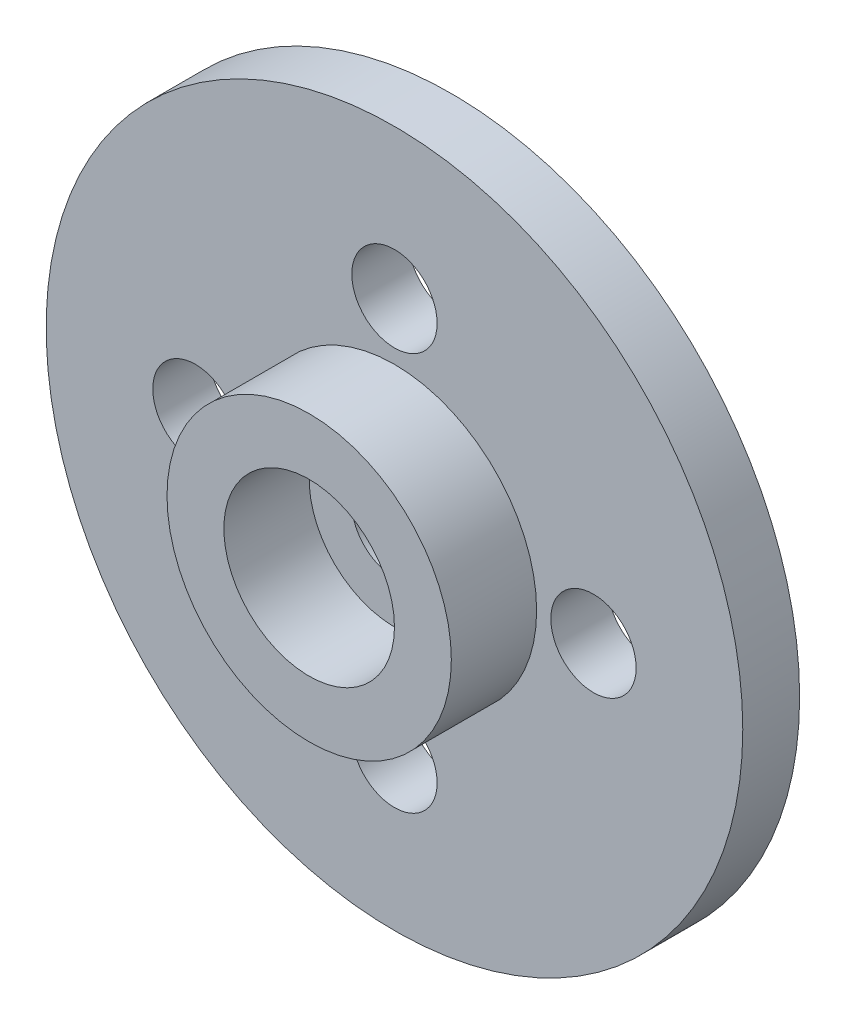
ISO-10303-21;
HEADER;
FILE_DESCRIPTION(('STEP AP214'),'2;1');
FILE_NAME('part.step','',(''),(''),'','','');
FILE_SCHEMA(('AUTOMOTIVE_DESIGN { 1 0 10303 214 1 1 1 1 }'));
ENDSEC;
DATA;
#1=APPLICATION_CONTEXT('core data for automotive mechanical design processes');
#2=APPLICATION_PROTOCOL_DEFINITION('international standard','automotive_design',2000,#1);
#3=PRODUCT_CONTEXT('',#1,'mechanical');
#4=PRODUCT('Part','Part','',(#3));
#5=PRODUCT_RELATED_PRODUCT_CATEGORY('part','',(#4));
#6=PRODUCT_DEFINITION_FORMATION('','',#4);
#7=PRODUCT_DEFINITION_CONTEXT('part definition',#1,'design');
#8=PRODUCT_DEFINITION('design','',#6,#7);
#9=PRODUCT_DEFINITION_SHAPE('','',#8);
#10=(LENGTH_UNIT() NAMED_UNIT(*) SI_UNIT(.MILLI.,.METRE.));
#11=(NAMED_UNIT(*) PLANE_ANGLE_UNIT() SI_UNIT($,.RADIAN.));
#12=(NAMED_UNIT(*) SI_UNIT($,.STERADIAN.) SOLID_ANGLE_UNIT());
#13=UNCERTAINTY_MEASURE_WITH_UNIT(LENGTH_MEASURE(1.E-05),#10,'distance_accuracy_value','');
#14=(GEOMETRIC_REPRESENTATION_CONTEXT(3) GLOBAL_UNCERTAINTY_ASSIGNED_CONTEXT((#13)) GLOBAL_UNIT_ASSIGNED_CONTEXT((#10,
#11,#12)) REPRESENTATION_CONTEXT('',''));
#15=CARTESIAN_POINT('',(0.,0.,0.));
#16=DIRECTION('',(0.,0.,1.));
#17=DIRECTION('',(1.,0.,0.));
#18=AXIS2_PLACEMENT_3D('',#15,#16,#17);
#19=CARTESIAN_POINT('',(0.,0.,2.));
#20=DIRECTION('',(0.,0.,1.));
#21=DIRECTION('',(1.,0.,0.));
#22=AXIS2_PLACEMENT_3D('',#19,#20,#21);
#23=PLANE('',#22);
#24=CARTESIAN_POINT('',(-7.,0.,2.));
#25=DIRECTION('',(0.,0.,1.));
#26=DIRECTION('',(1.,0.,0.));
#27=AXIS2_PLACEMENT_3D('',#24,#25,#26);
#28=CIRCLE('',#27,1.5);
#29=CARTESIAN_POINT('',(-5.5,0.,2.));
#30=VERTEX_POINT('',#29);
#31=EDGE_CURVE('E68',#30,#30,#28,.T.);
#32=ORIENTED_EDGE('',*,*,#31,.F.);
#33=EDGE_LOOP('',(#32));
#34=FACE_BOUND('',#33,.T.);
#35=CARTESIAN_POINT('',(0.,-7.,2.));
#36=DIRECTION('',(0.,0.,1.));
#37=DIRECTION('',(1.,0.,0.));
#38=AXIS2_PLACEMENT_3D('',#35,#36,#37);
#39=CIRCLE('',#38,1.5);
#40=CARTESIAN_POINT('',(1.50000000000002,-7.,2.));
#41=VERTEX_POINT('',#40);
#42=EDGE_CURVE('E71',#41,#41,#39,.T.);
#43=ORIENTED_EDGE('',*,*,#42,.F.);
#44=EDGE_LOOP('',(#43));
#45=FACE_BOUND('',#44,.T.);
#46=CARTESIAN_POINT('',(7.,0.,2.));
#47=DIRECTION('',(0.,0.,1.));
#48=DIRECTION('',(1.,0.,0.));
#49=AXIS2_PLACEMENT_3D('',#46,#47,#48);
#50=CIRCLE('',#49,1.5);
#51=CARTESIAN_POINT('',(8.5,0.,2.));
#52=VERTEX_POINT('',#51);
#53=EDGE_CURVE('E74',#52,#52,#50,.T.);
#54=ORIENTED_EDGE('',*,*,#53,.F.);
#55=EDGE_LOOP('',(#54));
#56=FACE_BOUND('',#55,.T.);
#57=CARTESIAN_POINT('',(0.,7.,2.));
#58=DIRECTION('',(0.,0.,1.));
#59=DIRECTION('',(1.,0.,0.));
#60=AXIS2_PLACEMENT_3D('',#57,#58,#59);
#61=CIRCLE('',#60,1.5);
#62=CARTESIAN_POINT('',(1.49999999999993,7.,2.));
#63=VERTEX_POINT('',#62);
#64=EDGE_CURVE('E77',#63,#63,#61,.T.);
#65=ORIENTED_EDGE('',*,*,#64,.F.);
#66=EDGE_LOOP('',(#65));
#67=FACE_BOUND('',#66,.T.);
#68=CARTESIAN_POINT('',(0.,0.,2.));
#69=DIRECTION('',(0.,0.,1.));
#70=DIRECTION('',(1.,0.,0.));
#71=AXIS2_PLACEMENT_3D('',#68,#69,#70);
#72=CIRCLE('',#71,5.);
#73=CARTESIAN_POINT('',(5.,0.,2.));
#74=VERTEX_POINT('',#73);
#75=EDGE_CURVE('E60',#74,#74,#72,.T.);
#76=ORIENTED_EDGE('',*,*,#75,.F.);
#77=EDGE_LOOP('',(#76));
#78=FACE_BOUND('',#77,.T.);
#79=CARTESIAN_POINT('',(0.,0.,2.));
#80=DIRECTION('',(0.,0.,1.));
#81=DIRECTION('',(1.,0.,0.));
#82=AXIS2_PLACEMENT_3D('',#79,#80,#81);
#83=CIRCLE('',#82,12.25);
#84=CARTESIAN_POINT('',(12.25,0.,2.));
#85=VERTEX_POINT('',#84);
#86=EDGE_CURVE('E43',#85,#85,#83,.T.);
#87=ORIENTED_EDGE('',*,*,#86,.T.);
#88=EDGE_LOOP('',(#87));
#89=FACE_BOUND('',#88,.T.);
#90=ADVANCED_FACE('F36',(#34,#45,#56,#67,#78,#89),#23,.T.);
#91=CARTESIAN_POINT('',(0.,0.,0.));
#92=DIRECTION('',(0.,0.,1.));
#93=DIRECTION('',(1.,0.,0.));
#94=AXIS2_PLACEMENT_3D('',#91,#92,#93);
#95=PLANE('',#94);
#96=CARTESIAN_POINT('',(0.,0.,0.));
#97=DIRECTION('',(0.,0.,1.));
#98=DIRECTION('',(1.,0.,0.));
#99=AXIS2_PLACEMENT_3D('',#96,#97,#98);
#100=CIRCLE('',#99,1.5);
#101=CARTESIAN_POINT('',(1.5,0.,0.));
#102=VERTEX_POINT('',#101);
#103=EDGE_CURVE('E54',#102,#102,#100,.T.);
#104=ORIENTED_EDGE('',*,*,#103,.T.);
#105=EDGE_LOOP('',(#104));
#106=FACE_BOUND('',#105,.T.);
#107=CARTESIAN_POINT('',(0.,7.,0.));
#108=DIRECTION('',(0.,0.,-1.));
#109=DIRECTION('',(-1.,0.,0.));
#110=AXIS2_PLACEMENT_3D('',#107,#108,#109);
#111=CIRCLE('',#110,1.5);
#112=CARTESIAN_POINT('',(-1.50000000000007,7.,0.));
#113=VERTEX_POINT('',#112);
#114=EDGE_CURVE('E81',#113,#113,#111,.T.);
#115=ORIENTED_EDGE('',*,*,#114,.F.);
#116=EDGE_LOOP('',(#115));
#117=FACE_BOUND('',#116,.T.);
#118=CARTESIAN_POINT('',(7.,0.,0.));
#119=DIRECTION('',(0.,0.,-1.));
#120=DIRECTION('',(-1.,0.,0.));
#121=AXIS2_PLACEMENT_3D('',#118,#119,#120);
#122=CIRCLE('',#121,1.5);
#123=CARTESIAN_POINT('',(5.5,0.,0.));
#124=VERTEX_POINT('',#123);
#125=EDGE_CURVE('E84',#124,#124,#122,.T.);
#126=ORIENTED_EDGE('',*,*,#125,.F.);
#127=EDGE_LOOP('',(#126));
#128=FACE_BOUND('',#127,.T.);
#129=CARTESIAN_POINT('',(0.,-7.,0.));
#130=DIRECTION('',(0.,0.,-1.));
#131=DIRECTION('',(-1.,0.,0.));
#132=AXIS2_PLACEMENT_3D('',#129,#130,#131);
#133=CIRCLE('',#132,1.5);
#134=CARTESIAN_POINT('',(-1.49999999999998,-7.,0.));
#135=VERTEX_POINT('',#134);
#136=EDGE_CURVE('E87',#135,#135,#133,.T.);
#137=ORIENTED_EDGE('',*,*,#136,.F.);
#138=EDGE_LOOP('',(#137));
#139=FACE_BOUND('',#138,.T.);
#140=CARTESIAN_POINT('',(-7.,0.,0.));
#141=DIRECTION('',(0.,0.,-1.));
#142=DIRECTION('',(-1.,0.,0.));
#143=AXIS2_PLACEMENT_3D('',#140,#141,#142);
#144=CIRCLE('',#143,1.5);
#145=CARTESIAN_POINT('',(-8.5,0.,0.));
#146=VERTEX_POINT('',#145);
#147=EDGE_CURVE('E80',#146,#146,#144,.T.);
#148=ORIENTED_EDGE('',*,*,#147,.F.);
#149=EDGE_LOOP('',(#148));
#150=FACE_BOUND('',#149,.T.);
#151=CARTESIAN_POINT('',(0.,0.,0.));
#152=DIRECTION('',(0.,0.,1.));
#153=DIRECTION('',(1.,0.,0.));
#154=AXIS2_PLACEMENT_3D('',#151,#152,#153);
#155=CIRCLE('',#154,12.25);
#156=CARTESIAN_POINT('',(12.25,0.,0.));
#157=VERTEX_POINT('',#156);
#158=EDGE_CURVE('E47',#157,#157,#155,.T.);
#159=ORIENTED_EDGE('',*,*,#158,.F.);
#160=EDGE_LOOP('',(#159));
#161=FACE_BOUND('',#160,.T.);
#162=ADVANCED_FACE('F95',(#106,#117,#128,#139,#150,#161),#95,.F.);
#163=CARTESIAN_POINT('',(0.,0.,2.));
#164=DIRECTION('',(0.,0.,1.));
#165=DIRECTION('',(1.,0.,0.));
#166=AXIS2_PLACEMENT_3D('',#163,#164,#165);
#167=CIRCLE('',#166,1.5);
#168=CARTESIAN_POINT('',(1.5,0.,2.));
#169=VERTEX_POINT('',#168);
#170=EDGE_CURVE('E52',#169,#169,#167,.T.);
#171=ORIENTED_EDGE('',*,*,#170,.F.);
#172=EDGE_LOOP('',(#171));
#173=FACE_BOUND('',#172,.T.);
#174=CARTESIAN_POINT('',(0.,0.,2.));
#175=DIRECTION('',(0.,0.,1.));
#176=DIRECTION('',(1.,0.,0.));
#177=AXIS2_PLACEMENT_3D('',#174,#175,#176);
#178=CIRCLE('',#177,3.);
#179=CARTESIAN_POINT('',(3.,0.,2.));
#180=VERTEX_POINT('',#179);
#181=EDGE_CURVE('E10',#180,#180,#178,.F.);
#182=ORIENTED_EDGE('',*,*,#181,.F.);
#183=EDGE_LOOP('',(#182));
#184=FACE_BOUND('',#183,.T.);
#185=ADVANCED_FACE('F98',(#173,#184),#23,.T.);
#186=CARTESIAN_POINT('',(0.,0.,2.));
#187=DIRECTION('',(0.,0.,-1.));
#188=DIRECTION('',(-1.,0.,0.));
#189=AXIS2_PLACEMENT_3D('',#186,#187,#188);
#190=CYLINDRICAL_SURFACE('',#189,12.25);
#191=ORIENTED_EDGE('',*,*,#158,.T.);
#192=EDGE_LOOP('',(#191));
#193=FACE_BOUND('',#192,.T.);
#194=ORIENTED_EDGE('',*,*,#86,.F.);
#195=EDGE_LOOP('',(#194));
#196=FACE_BOUND('',#195,.T.);
#197=ADVANCED_FACE('F38',(#193,#196),#190,.T.);
#198=CARTESIAN_POINT('',(0.,0.,2.));
#199=DIRECTION('',(0.,0.,-1.));
#200=DIRECTION('',(-1.,0.,0.));
#201=AXIS2_PLACEMENT_3D('',#198,#199,#200);
#202=CYLINDRICAL_SURFACE('',#201,1.5);
#203=ORIENTED_EDGE('',*,*,#170,.T.);
#204=EDGE_LOOP('',(#203));
#205=FACE_BOUND('',#204,.T.);
#206=ORIENTED_EDGE('',*,*,#103,.F.);
#207=EDGE_LOOP('',(#206));
#208=FACE_BOUND('',#207,.T.);
#209=ADVANCED_FACE('F104',(#205,#208),#202,.F.);
#210=CARTESIAN_POINT('',(0.,0.,5.));
#211=DIRECTION('',(0.,0.,1.));
#212=DIRECTION('',(1.,0.,0.));
#213=AXIS2_PLACEMENT_3D('',#210,#211,#212);
#214=PLANE('',#213);
#215=CARTESIAN_POINT('',(0.,0.,5.));
#216=DIRECTION('',(0.,0.,1.));
#217=DIRECTION('',(1.,0.,0.));
#218=AXIS2_PLACEMENT_3D('',#215,#216,#217);
#219=CIRCLE('',#218,5.);
#220=CARTESIAN_POINT('',(5.,0.,5.));
#221=VERTEX_POINT('',#220);
#222=EDGE_CURVE('E57',#221,#221,#219,.T.);
#223=ORIENTED_EDGE('',*,*,#222,.T.);
#224=EDGE_LOOP('',(#223));
#225=FACE_BOUND('',#224,.T.);
#226=CARTESIAN_POINT('',(0.,0.,5.));
#227=DIRECTION('',(0.,0.,1.));
#228=DIRECTION('',(1.,0.,0.));
#229=AXIS2_PLACEMENT_3D('',#226,#227,#228);
#230=CIRCLE('',#229,3.);
#231=CARTESIAN_POINT('',(3.,0.,5.));
#232=VERTEX_POINT('',#231);
#233=EDGE_CURVE('E63',#232,#232,#230,.T.);
#234=ORIENTED_EDGE('',*,*,#233,.F.);
#235=EDGE_LOOP('',(#234));
#236=FACE_BOUND('',#235,.T.);
#237=ADVANCED_FACE('F109',(#225,#236),#214,.T.);
#238=CARTESIAN_POINT('',(0.,0.,5.));
#239=DIRECTION('',(0.,0.,-1.));
#240=DIRECTION('',(-1.,0.,0.));
#241=AXIS2_PLACEMENT_3D('',#238,#239,#240);
#242=CYLINDRICAL_SURFACE('',#241,5.);
#243=ORIENTED_EDGE('',*,*,#222,.F.);
#244=EDGE_LOOP('',(#243));
#245=FACE_BOUND('',#244,.T.);
#246=ORIENTED_EDGE('',*,*,#75,.T.);
#247=EDGE_LOOP('',(#246));
#248=FACE_BOUND('',#247,.T.);
#249=ADVANCED_FACE('F121',(#245,#248),#242,.T.);
#250=CARTESIAN_POINT('',(0.,0.,5.));
#251=DIRECTION('',(0.,0.,-1.));
#252=DIRECTION('',(-1.,0.,0.));
#253=AXIS2_PLACEMENT_3D('',#250,#251,#252);
#254=CYLINDRICAL_SURFACE('',#253,3.);
#255=ORIENTED_EDGE('',*,*,#233,.T.);
#256=EDGE_LOOP('',(#255));
#257=FACE_BOUND('',#256,.T.);
#258=ORIENTED_EDGE('',*,*,#181,.T.);
#259=EDGE_LOOP('',(#258));
#260=FACE_BOUND('',#259,.T.);
#261=ADVANCED_FACE('F124',(#257,#260),#254,.F.);
#262=CARTESIAN_POINT('',(0.,7.,10.));
#263=DIRECTION('',(0.,0.,-1.));
#264=DIRECTION('',(-1.,0.,0.));
#265=AXIS2_PLACEMENT_3D('',#262,#263,#264);
#266=CYLINDRICAL_SURFACE('',#265,1.5);
#267=ORIENTED_EDGE('',*,*,#64,.T.);
#268=EDGE_LOOP('',(#267));
#269=FACE_BOUND('',#268,.T.);
#270=ORIENTED_EDGE('',*,*,#114,.T.);
#271=EDGE_LOOP('',(#270));
#272=FACE_BOUND('',#271,.T.);
#273=ADVANCED_FACE('F131',(#269,#272),#266,.F.);
#274=CARTESIAN_POINT('',(7.,0.,10.));
#275=DIRECTION('',(0.,0.,-1.));
#276=DIRECTION('',(-1.,0.,0.));
#277=AXIS2_PLACEMENT_3D('',#274,#275,#276);
#278=CYLINDRICAL_SURFACE('',#277,1.5);
#279=ORIENTED_EDGE('',*,*,#53,.T.);
#280=EDGE_LOOP('',(#279));
#281=FACE_BOUND('',#280,.T.);
#282=ORIENTED_EDGE('',*,*,#125,.T.);
#283=EDGE_LOOP('',(#282));
#284=FACE_BOUND('',#283,.T.);
#285=ADVANCED_FACE('F135',(#281,#284),#278,.F.);
#286=CARTESIAN_POINT('',(0.,-7.,10.));
#287=DIRECTION('',(0.,0.,-1.));
#288=DIRECTION('',(-1.,0.,0.));
#289=AXIS2_PLACEMENT_3D('',#286,#287,#288);
#290=CYLINDRICAL_SURFACE('',#289,1.5);
#291=ORIENTED_EDGE('',*,*,#42,.T.);
#292=EDGE_LOOP('',(#291));
#293=FACE_BOUND('',#292,.T.);
#294=ORIENTED_EDGE('',*,*,#136,.T.);
#295=EDGE_LOOP('',(#294));
#296=FACE_BOUND('',#295,.T.);
#297=ADVANCED_FACE('F139',(#293,#296),#290,.F.);
#298=CARTESIAN_POINT('',(-7.,0.,10.));
#299=DIRECTION('',(0.,0.,-1.));
#300=DIRECTION('',(-1.,0.,0.));
#301=AXIS2_PLACEMENT_3D('',#298,#299,#300);
#302=CYLINDRICAL_SURFACE('',#301,1.5);
#303=ORIENTED_EDGE('',*,*,#31,.T.);
#304=EDGE_LOOP('',(#303));
#305=FACE_BOUND('',#304,.T.);
#306=ORIENTED_EDGE('',*,*,#147,.T.);
#307=EDGE_LOOP('',(#306));
#308=FACE_BOUND('',#307,.T.);
#309=ADVANCED_FACE('F93',(#305,#308),#302,.F.);
#310=CLOSED_SHELL('',(#90,#162,#185,#197,#209,#237,#249,#261,#273,#285,#297,#309));
#311=MANIFOLD_SOLID_BREP('B2',#310);
#312=ADVANCED_BREP_SHAPE_REPRESENTATION('',(#18,#311),#14);
#313=SHAPE_DEFINITION_REPRESENTATION(#9,#312);
ENDSEC;
END-ISO-10303-21;
